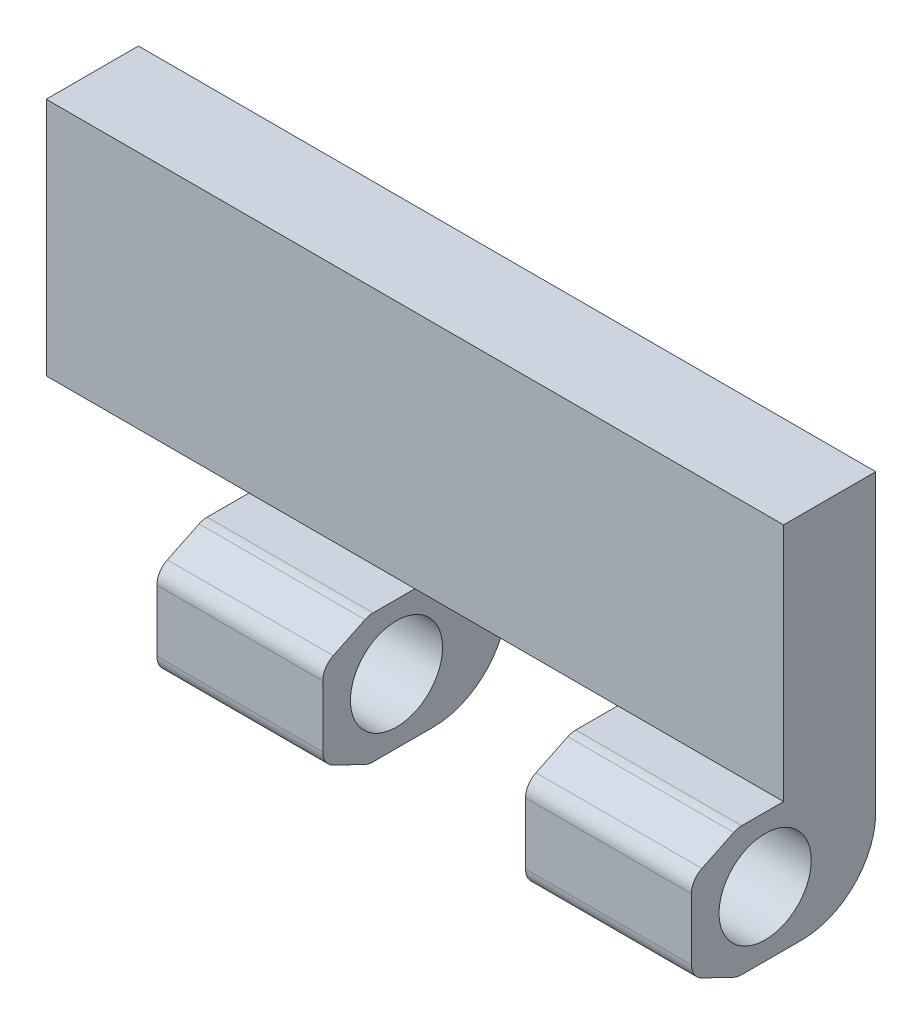
ISO-10303-21;
HEADER;
FILE_DESCRIPTION(('STEP AP214'),'2;1');
FILE_NAME('part.step','',(''),(''),'','','');
FILE_SCHEMA(('AUTOMOTIVE_DESIGN { 1 0 10303 214 1 1 1 1 }'));
ENDSEC;
DATA;
#1=APPLICATION_CONTEXT('core data for automotive mechanical design processes');
#2=APPLICATION_PROTOCOL_DEFINITION('international standard','automotive_design',2000,#1);
#3=PRODUCT_CONTEXT('',#1,'mechanical');
#4=PRODUCT('Part','Part','',(#3));
#5=PRODUCT_RELATED_PRODUCT_CATEGORY('part','',(#4));
#6=PRODUCT_DEFINITION_FORMATION('','',#4);
#7=PRODUCT_DEFINITION_CONTEXT('part definition',#1,'design');
#8=PRODUCT_DEFINITION('design','',#6,#7);
#9=PRODUCT_DEFINITION_SHAPE('','',#8);
#10=(LENGTH_UNIT() NAMED_UNIT(*) SI_UNIT(.MILLI.,.METRE.));
#11=(NAMED_UNIT(*) PLANE_ANGLE_UNIT() SI_UNIT($,.RADIAN.));
#12=(NAMED_UNIT(*) SI_UNIT($,.STERADIAN.) SOLID_ANGLE_UNIT());
#13=UNCERTAINTY_MEASURE_WITH_UNIT(LENGTH_MEASURE(1.E-05),#10,'distance_accuracy_value','');
#14=(GEOMETRIC_REPRESENTATION_CONTEXT(3) GLOBAL_UNCERTAINTY_ASSIGNED_CONTEXT((#13)) GLOBAL_UNIT_ASSIGNED_CONTEXT((#10,
#11,#12)) REPRESENTATION_CONTEXT('',''));
#15=CARTESIAN_POINT('',(0.,0.,0.));
#16=DIRECTION('',(0.,0.,1.));
#17=DIRECTION('',(1.,0.,0.));
#18=AXIS2_PLACEMENT_3D('',#15,#16,#17);
#19=CARTESIAN_POINT('',(11.,-6.5,0.));
#20=DIRECTION('',(0.,0.,-1.));
#21=DIRECTION('',(0.,1.,0.));
#22=AXIS2_PLACEMENT_3D('',#19,#20,#21);
#23=PLANE('',#22);
#24=DIRECTION('',(0.,1.,0.));
#25=VECTOR('',#24,1.);
#26=CARTESIAN_POINT('',(20.,-6.5,0.));
#27=LINE('',#26,#25);
#28=CARTESIAN_POINT('',(20.,-9.5,0.));
#29=VERTEX_POINT('',#28);
#30=CARTESIAN_POINT('',(20.,6.5,0.));
#31=VERTEX_POINT('',#30);
#32=EDGE_CURVE('E187',#29,#31,#27,.T.);
#33=ORIENTED_EDGE('',*,*,#32,.F.);
#34=DIRECTION('',(1.,0.,0.));
#35=VECTOR('',#34,1.);
#36=CARTESIAN_POINT('',(11.,-9.5,0.));
#37=LINE('',#36,#35);
#38=CARTESIAN_POINT('',(11.,-9.5,0.));
#39=VERTEX_POINT('',#38);
#40=EDGE_CURVE('E11',#39,#29,#37,.T.);
#41=ORIENTED_EDGE('',*,*,#40,.F.);
#42=DIRECTION('',(0.,1.,0.));
#43=VECTOR('',#42,1.);
#44=CARTESIAN_POINT('',(11.,-6.5,0.));
#45=LINE('',#44,#43);
#46=CARTESIAN_POINT('',(11.,-6.5,0.));
#47=VERTEX_POINT('',#46);
#48=EDGE_CURVE('E149',#39,#47,#45,.T.);
#49=ORIENTED_EDGE('',*,*,#48,.T.);
#50=DIRECTION('',(1.,0.,0.));
#51=VECTOR('',#50,1.);
#52=CARTESIAN_POINT('',(20.,-6.5,0.));
#53=LINE('',#52,#51);
#54=CARTESIAN_POINT('',(0.,-6.5,0.));
#55=VERTEX_POINT('',#54);
#56=EDGE_CURVE('E240',#55,#47,#53,.T.);
#57=ORIENTED_EDGE('',*,*,#56,.F.);
#58=DIRECTION('',(0.,1.,0.));
#59=VECTOR('',#58,1.);
#60=CARTESIAN_POINT('',(0.,-6.5,0.));
#61=LINE('',#60,#59);
#62=CARTESIAN_POINT('',(0.,-9.5,0.));
#63=VERTEX_POINT('',#62);
#64=EDGE_CURVE('E317',#63,#55,#61,.T.);
#65=ORIENTED_EDGE('',*,*,#64,.F.);
#66=DIRECTION('',(1.,0.,0.));
#67=VECTOR('',#66,1.);
#68=CARTESIAN_POINT('',(-9.,-9.5,0.));
#69=LINE('',#68,#67);
#70=CARTESIAN_POINT('',(-9.,-9.5,0.));
#71=VERTEX_POINT('',#70);
#72=EDGE_CURVE('E325',#71,#63,#69,.T.);
#73=ORIENTED_EDGE('',*,*,#72,.F.);
#74=DIRECTION('',(0.,1.,0.));
#75=VECTOR('',#74,1.);
#76=CARTESIAN_POINT('',(-9.,-6.5,0.));
#77=LINE('',#76,#75);
#78=CARTESIAN_POINT('',(-9.,-6.5,0.));
#79=VERTEX_POINT('',#78);
#80=EDGE_CURVE('E283',#71,#79,#77,.T.);
#81=ORIENTED_EDGE('',*,*,#80,.T.);
#82=CARTESIAN_POINT('',(-20.,-6.5,0.));
#83=VERTEX_POINT('',#82);
#84=EDGE_CURVE('E236',#83,#79,#53,.T.);
#85=ORIENTED_EDGE('',*,*,#84,.F.);
#86=DIRECTION('',(0.,-1.,0.));
#87=VECTOR('',#86,1.);
#88=CARTESIAN_POINT('',(-20.,-6.5,0.));
#89=LINE('',#88,#87);
#90=CARTESIAN_POINT('',(-20.,6.5,0.));
#91=VERTEX_POINT('',#90);
#92=EDGE_CURVE('E233',#91,#83,#89,.T.);
#93=ORIENTED_EDGE('',*,*,#92,.F.);
#94=DIRECTION('',(-1.,0.,0.));
#95=VECTOR('',#94,1.);
#96=CARTESIAN_POINT('',(20.,6.5,0.));
#97=LINE('',#96,#95);
#98=EDGE_CURVE('E231',#31,#91,#97,.T.);
#99=ORIENTED_EDGE('',*,*,#98,.F.);
#100=EDGE_LOOP('',(#33,#41,#49,#57,#65,#73,#81,#85,#93,#99));
#101=FACE_BOUND('',#100,.T.);
#102=ADVANCED_FACE('F41',(#101),#23,.T.);
#103=CARTESIAN_POINT('',(11.,-9.5,4.));
#104=DIRECTION('',(1.,0.,0.));
#105=DIRECTION('',(0.,0.,-1.));
#106=AXIS2_PLACEMENT_3D('',#103,#104,#105);
#107=CYLINDRICAL_SURFACE('',#106,4.);
#108=CARTESIAN_POINT('',(20.,-9.5,4.));
#109=DIRECTION('',(1.,0.,0.));
#110=DIRECTION('',(0.,0.,-1.));
#111=AXIS2_PLACEMENT_3D('',#108,#109,#110);
#112=CIRCLE('',#111,4.);
#113=CARTESIAN_POINT('',(20.,-13.5,4.));
#114=VERTEX_POINT('',#113);
#115=EDGE_CURVE('E140',#114,#29,#112,.T.);
#116=ORIENTED_EDGE('',*,*,#115,.F.);
#117=DIRECTION('',(1.,0.,0.));
#118=VECTOR('',#117,1.);
#119=CARTESIAN_POINT('',(11.,-13.5,4.));
#120=LINE('',#119,#118);
#121=CARTESIAN_POINT('',(11.,-13.5,4.));
#122=VERTEX_POINT('',#121);
#123=EDGE_CURVE('E49',#122,#114,#120,.T.);
#124=ORIENTED_EDGE('',*,*,#123,.F.);
#125=CARTESIAN_POINT('',(11.,-9.5,4.));
#126=DIRECTION('',(1.,0.,0.));
#127=DIRECTION('',(0.,0.,-1.));
#128=AXIS2_PLACEMENT_3D('',#125,#126,#127);
#129=CIRCLE('',#128,4.);
#130=EDGE_CURVE('E136',#122,#39,#129,.T.);
#131=ORIENTED_EDGE('',*,*,#130,.T.);
#132=ORIENTED_EDGE('',*,*,#40,.T.);
#133=EDGE_LOOP('',(#116,#124,#131,#132));
#134=FACE_BOUND('',#133,.T.);
#135=ADVANCED_FACE('F133',(#134),#107,.T.);
#136=CARTESIAN_POINT('',(11.,-13.5,4.));
#137=DIRECTION('',(0.,-1.,0.));
#138=DIRECTION('',(0.,0.,-1.));
#139=AXIS2_PLACEMENT_3D('',#136,#137,#138);
#140=PLANE('',#139);
#141=DIRECTION('',(0.,0.,-1.));
#142=VECTOR('',#141,1.);
#143=CARTESIAN_POINT('',(20.,-13.5,4.));
#144=LINE('',#143,#142);
#145=CARTESIAN_POINT('',(20.,-13.5,7.27242922935632));
#146=VERTEX_POINT('',#145);
#147=EDGE_CURVE('E181',#146,#114,#144,.T.);
#148=ORIENTED_EDGE('',*,*,#147,.F.);
#149=DIRECTION('',(1.,0.,0.));
#150=VECTOR('',#149,1.);
#151=CARTESIAN_POINT('',(11.,-13.5,7.27242922935632));
#152=LINE('',#151,#150);
#153=CARTESIAN_POINT('',(11.,-13.5,7.27242922935632));
#154=VERTEX_POINT('',#153);
#155=EDGE_CURVE('E142',#154,#146,#152,.T.);
#156=ORIENTED_EDGE('',*,*,#155,.F.);
#157=DIRECTION('',(0.,0.,-1.));
#158=VECTOR('',#157,1.);
#159=CARTESIAN_POINT('',(11.,-13.5,4.));
#160=LINE('',#159,#158);
#161=EDGE_CURVE('E150',#154,#122,#160,.T.);
#162=ORIENTED_EDGE('',*,*,#161,.T.);
#163=ORIENTED_EDGE('',*,*,#123,.T.);
#164=EDGE_LOOP('',(#148,#156,#162,#163));
#165=FACE_BOUND('',#164,.T.);
#166=ADVANCED_FACE('F151',(#165),#140,.T.);
#167=CARTESIAN_POINT('',(11.,-12.5,7.27242922935632));
#168=DIRECTION('',(1.,0.,0.));
#169=DIRECTION('',(0.,0.,-1.));
#170=AXIS2_PLACEMENT_3D('',#167,#168,#169);
#171=CYLINDRICAL_SURFACE('',#170,0.999999999999999);
#172=CARTESIAN_POINT('',(20.,-12.5,7.27242922935632));
#173=DIRECTION('',(1.,0.,0.));
#174=DIRECTION('',(0.,0.,-1.));
#175=AXIS2_PLACEMENT_3D('',#172,#173,#174);
#176=CIRCLE('',#175,0.999999999999999);
#177=CARTESIAN_POINT('',(20.,-13.4015230574683,7.7051602969411));
#178=VERTEX_POINT('',#177);
#179=EDGE_CURVE('E179',#178,#146,#176,.T.);
#180=ORIENTED_EDGE('',*,*,#179,.F.);
#181=DIRECTION('',(1.,0.,0.));
#182=VECTOR('',#181,1.);
#183=CARTESIAN_POINT('',(11.,-13.4015230574683,7.7051602969411));
#184=LINE('',#183,#182);
#185=CARTESIAN_POINT('',(11.,-13.4015230574683,7.7051602969411));
#186=VERTEX_POINT('',#185);
#187=EDGE_CURVE('E188',#186,#178,#184,.T.);
#188=ORIENTED_EDGE('',*,*,#187,.F.);
#189=CARTESIAN_POINT('',(11.,-12.5,7.27242922935632));
#190=DIRECTION('',(1.,0.,0.));
#191=DIRECTION('',(0.,0.,-1.));
#192=AXIS2_PLACEMENT_3D('',#189,#190,#191);
#193=CIRCLE('',#192,0.999999999999999);
#194=EDGE_CURVE('E155',#186,#154,#193,.T.);
#195=ORIENTED_EDGE('',*,*,#194,.T.);
#196=ORIENTED_EDGE('',*,*,#155,.T.);
#197=EDGE_LOOP('',(#180,#188,#195,#196));
#198=FACE_BOUND('',#197,.T.);
#199=ADVANCED_FACE('F488',(#198),#171,.T.);
#200=CARTESIAN_POINT('',(11.,-13.4015230574683,7.7051602969411));
#201=DIRECTION('',(0.,-0.901523057468274,0.43273106758477));
#202=DIRECTION('',(0.,-0.43273106758477,-0.901523057468274));
#203=AXIS2_PLACEMENT_3D('',#200,#201,#202);
#204=PLANE('',#203);
#205=DIRECTION('',(0.,-0.43273106758477,-0.901523057468274));
#206=VECTOR('',#205,1.);
#207=CARTESIAN_POINT('',(20.,-13.4015230574683,7.7051602969411));
#208=LINE('',#207,#206);
#209=CARTESIAN_POINT('',(20.,-12.5722890875593,9.43273106758476));
#210=VERTEX_POINT('',#209);
#211=EDGE_CURVE('E180',#210,#178,#208,.T.);
#212=ORIENTED_EDGE('',*,*,#211,.F.);
#213=DIRECTION('',(1.,0.,0.));
#214=VECTOR('',#213,1.);
#215=CARTESIAN_POINT('',(11.,-12.5722890875593,9.43273106758476));
#216=LINE('',#215,#214);
#217=CARTESIAN_POINT('',(11.,-12.5722890875593,9.43273106758476));
#218=VERTEX_POINT('',#217);
#219=EDGE_CURVE('E195',#218,#210,#216,.T.);
#220=ORIENTED_EDGE('',*,*,#219,.F.);
#221=DIRECTION('',(0.,-0.43273106758477,-0.901523057468274));
#222=VECTOR('',#221,1.);
#223=CARTESIAN_POINT('',(11.,-13.4015230574683,7.7051602969411));
#224=LINE('',#223,#222);
#225=EDGE_CURVE('E152',#218,#186,#224,.T.);
#226=ORIENTED_EDGE('',*,*,#225,.T.);
#227=ORIENTED_EDGE('',*,*,#187,.T.);
#228=EDGE_LOOP('',(#212,#220,#226,#227));
#229=FACE_BOUND('',#228,.T.);
#230=ADVANCED_FACE('F372',(#229),#204,.T.);
#231=CARTESIAN_POINT('',(11.,-11.670766030091,9.));
#232=DIRECTION('',(1.,0.,0.));
#233=DIRECTION('',(0.,0.,-1.));
#234=AXIS2_PLACEMENT_3D('',#231,#232,#233);
#235=CYLINDRICAL_SURFACE('',#234,0.999999999999999);
#236=CARTESIAN_POINT('',(20.,-11.670766030091,9.));
#237=DIRECTION('',(1.,0.,0.));
#238=DIRECTION('',(0.,0.,1.));
#239=AXIS2_PLACEMENT_3D('',#236,#237,#238);
#240=CIRCLE('',#239,0.999999999999999);
#241=CARTESIAN_POINT('',(20.,-11.670766030091,10.));
#242=VERTEX_POINT('',#241);
#243=EDGE_CURVE('E171',#242,#210,#240,.T.);
#244=ORIENTED_EDGE('',*,*,#243,.F.);
#245=DIRECTION('',(1.,0.,0.));
#246=VECTOR('',#245,1.);
#247=CARTESIAN_POINT('',(11.,-11.670766030091,10.));
#248=LINE('',#247,#246);
#249=CARTESIAN_POINT('',(11.,-11.670766030091,10.));
#250=VERTEX_POINT('',#249);
#251=EDGE_CURVE('E193',#250,#242,#248,.T.);
#252=ORIENTED_EDGE('',*,*,#251,.F.);
#253=CARTESIAN_POINT('',(11.,-11.670766030091,9.));
#254=DIRECTION('',(1.,0.,0.));
#255=DIRECTION('',(0.,0.,1.));
#256=AXIS2_PLACEMENT_3D('',#253,#254,#255);
#257=CIRCLE('',#256,0.999999999999999);
#258=EDGE_CURVE('E366',#250,#218,#257,.T.);
#259=ORIENTED_EDGE('',*,*,#258,.T.);
#260=ORIENTED_EDGE('',*,*,#219,.T.);
#261=EDGE_LOOP('',(#244,#252,#259,#260));
#262=FACE_BOUND('',#261,.T.);
#263=ADVANCED_FACE('F379',(#262),#235,.T.);
#264=CARTESIAN_POINT('',(11.,-11.670766030091,10.));
#265=DIRECTION('',(0.,0.,1.));
#266=DIRECTION('',(1.,0.,0.));
#267=AXIS2_PLACEMENT_3D('',#264,#265,#266);
#268=PLANE('',#267);
#269=DIRECTION('',(0.,-1.,0.));
#270=VECTOR('',#269,1.);
#271=CARTESIAN_POINT('',(20.,-11.670766030091,10.));
#272=LINE('',#271,#270);
#273=CARTESIAN_POINT('',(20.,-8.32923396990897,10.));
#274=VERTEX_POINT('',#273);
#275=EDGE_CURVE('E172',#274,#242,#272,.T.);
#276=ORIENTED_EDGE('',*,*,#275,.F.);
#277=DIRECTION('',(1.,0.,0.));
#278=VECTOR('',#277,1.);
#279=CARTESIAN_POINT('',(11.,-8.32923396990897,10.));
#280=LINE('',#279,#278);
#281=CARTESIAN_POINT('',(11.,-8.32923396990897,10.));
#282=VERTEX_POINT('',#281);
#283=EDGE_CURVE('E198',#282,#274,#280,.T.);
#284=ORIENTED_EDGE('',*,*,#283,.F.);
#285=DIRECTION('',(0.,-1.,0.));
#286=VECTOR('',#285,1.);
#287=CARTESIAN_POINT('',(11.,-11.670766030091,10.));
#288=LINE('',#287,#286);
#289=EDGE_CURVE('E364',#282,#250,#288,.T.);
#290=ORIENTED_EDGE('',*,*,#289,.T.);
#291=ORIENTED_EDGE('',*,*,#251,.T.);
#292=EDGE_LOOP('',(#276,#284,#290,#291));
#293=FACE_BOUND('',#292,.T.);
#294=ADVANCED_FACE('F382',(#293),#268,.T.);
#295=CARTESIAN_POINT('',(11.,-8.32923396990896,9.));
#296=DIRECTION('',(1.,0.,0.));
#297=DIRECTION('',(0.,0.,-1.));
#298=AXIS2_PLACEMENT_3D('',#295,#296,#297);
#299=CYLINDRICAL_SURFACE('',#298,1.);
#300=CARTESIAN_POINT('',(20.,-8.32923396990896,9.));
#301=DIRECTION('',(1.,0.,0.));
#302=DIRECTION('',(0.,0.,-1.));
#303=AXIS2_PLACEMENT_3D('',#300,#301,#302);
#304=CIRCLE('',#303,1.);
#305=CARTESIAN_POINT('',(20.,-7.42771091244068,9.43273106758476));
#306=VERTEX_POINT('',#305);
#307=EDGE_CURVE('E169',#306,#274,#304,.T.);
#308=ORIENTED_EDGE('',*,*,#307,.F.);
#309=DIRECTION('',(1.,0.,0.));
#310=VECTOR('',#309,1.);
#311=CARTESIAN_POINT('',(11.,-7.42771091244068,9.43273106758476));
#312=LINE('',#311,#310);
#313=CARTESIAN_POINT('',(11.,-7.42771091244068,9.43273106758476));
#314=VERTEX_POINT('',#313);
#315=EDGE_CURVE('E196',#314,#306,#312,.T.);
#316=ORIENTED_EDGE('',*,*,#315,.F.);
#317=CARTESIAN_POINT('',(11.,-8.32923396990896,9.));
#318=DIRECTION('',(1.,0.,0.));
#319=DIRECTION('',(0.,0.,-1.));
#320=AXIS2_PLACEMENT_3D('',#317,#318,#319);
#321=CIRCLE('',#320,1.);
#322=EDGE_CURVE('E362',#314,#282,#321,.T.);
#323=ORIENTED_EDGE('',*,*,#322,.T.);
#324=ORIENTED_EDGE('',*,*,#283,.T.);
#325=EDGE_LOOP('',(#308,#316,#323,#324));
#326=FACE_BOUND('',#325,.T.);
#327=ADVANCED_FACE('F389',(#326),#299,.T.);
#328=CARTESIAN_POINT('',(11.,-6.59847694253173,7.7051602969411));
#329=DIRECTION('',(0.,0.901523057468274,0.432731067584771));
#330=DIRECTION('',(0.,-0.432731067584771,0.901523057468274));
#331=AXIS2_PLACEMENT_3D('',#328,#329,#330);
#332=PLANE('',#331);
#333=DIRECTION('',(0.,-0.432731067584771,0.901523057468274));
#334=VECTOR('',#333,1.);
#335=CARTESIAN_POINT('',(20.,-6.59847694253173,7.7051602969411));
#336=LINE('',#335,#334);
#337=CARTESIAN_POINT('',(20.,-6.59847694253173,7.7051602969411));
#338=VERTEX_POINT('',#337);
#339=EDGE_CURVE('E164',#338,#306,#336,.T.);
#340=ORIENTED_EDGE('',*,*,#339,.F.);
#341=DIRECTION('',(1.,0.,0.));
#342=VECTOR('',#341,1.);
#343=CARTESIAN_POINT('',(11.,-6.59847694253173,7.7051602969411));
#344=LINE('',#343,#342);
#345=CARTESIAN_POINT('',(11.,-6.59847694253173,7.7051602969411));
#346=VERTEX_POINT('',#345);
#347=EDGE_CURVE('E200',#346,#338,#344,.T.);
#348=ORIENTED_EDGE('',*,*,#347,.F.);
#349=DIRECTION('',(0.,-0.432731067584771,0.901523057468274));
#350=VECTOR('',#349,1.);
#351=CARTESIAN_POINT('',(11.,-6.59847694253173,7.7051602969411));
#352=LINE('',#351,#350);
#353=EDGE_CURVE('E358',#346,#314,#352,.T.);
#354=ORIENTED_EDGE('',*,*,#353,.T.);
#355=ORIENTED_EDGE('',*,*,#315,.T.);
#356=EDGE_LOOP('',(#340,#348,#354,#355));
#357=FACE_BOUND('',#356,.T.);
#358=ADVANCED_FACE('F388',(#357),#332,.T.);
#359=CARTESIAN_POINT('',(11.,-7.5,7.27242922935632));
#360=DIRECTION('',(1.,0.,0.));
#361=DIRECTION('',(0.,0.,-1.));
#362=AXIS2_PLACEMENT_3D('',#359,#360,#361);
#363=CYLINDRICAL_SURFACE('',#362,1.);
#364=CARTESIAN_POINT('',(20.,-7.5,7.27242922935632));
#365=DIRECTION('',(1.,0.,0.));
#366=DIRECTION('',(0.,0.,1.));
#367=AXIS2_PLACEMENT_3D('',#364,#365,#366);
#368=CIRCLE('',#367,1.);
#369=CARTESIAN_POINT('',(20.,-6.5,7.27242922935632));
#370=VERTEX_POINT('',#369);
#371=EDGE_CURVE('E161',#370,#338,#368,.T.);
#372=ORIENTED_EDGE('',*,*,#371,.F.);
#373=DIRECTION('',(1.,0.,0.));
#374=VECTOR('',#373,1.);
#375=CARTESIAN_POINT('',(11.,-6.5,7.27242922935632));
#376=LINE('',#375,#374);
#377=CARTESIAN_POINT('',(11.,-6.5,7.27242922935632));
#378=VERTEX_POINT('',#377);
#379=EDGE_CURVE('E44',#378,#370,#376,.T.);
#380=ORIENTED_EDGE('',*,*,#379,.F.);
#381=CARTESIAN_POINT('',(11.,-7.5,7.27242922935632));
#382=DIRECTION('',(1.,0.,0.));
#383=DIRECTION('',(0.,0.,1.));
#384=AXIS2_PLACEMENT_3D('',#381,#382,#383);
#385=CIRCLE('',#384,1.);
#386=EDGE_CURVE('E360',#378,#346,#385,.T.);
#387=ORIENTED_EDGE('',*,*,#386,.T.);
#388=ORIENTED_EDGE('',*,*,#347,.T.);
#389=EDGE_LOOP('',(#372,#380,#387,#388));
#390=FACE_BOUND('',#389,.T.);
#391=ADVANCED_FACE('F206',(#390),#363,.T.);
#392=CARTESIAN_POINT('',(11.,-6.5,7.27242922935632));
#393=DIRECTION('',(0.,1.,0.));
#394=DIRECTION('',(0.,0.,1.));
#395=AXIS2_PLACEMENT_3D('',#392,#393,#394);
#396=PLANE('',#395);
#397=DIRECTION('',(1.,0.,0.));
#398=VECTOR('',#397,1.);
#399=CARTESIAN_POINT('',(20.,-6.5,5.));
#400=LINE('',#399,#398);
#401=CARTESIAN_POINT('',(11.,-6.5,5.));
#402=VERTEX_POINT('',#401);
#403=CARTESIAN_POINT('',(20.,-6.5,5.));
#404=VERTEX_POINT('',#403);
#405=EDGE_CURVE('E59',#402,#404,#400,.T.);
#406=ORIENTED_EDGE('',*,*,#405,.F.);
#407=DIRECTION('',(0.,0.,1.));
#408=VECTOR('',#407,1.);
#409=CARTESIAN_POINT('',(11.,-6.5,5.));
#410=LINE('',#409,#408);
#411=EDGE_CURVE('E108',#402,#378,#410,.T.);
#412=ORIENTED_EDGE('',*,*,#411,.T.);
#413=ORIENTED_EDGE('',*,*,#379,.T.);
#414=DIRECTION('',(0.,0.,1.));
#415=VECTOR('',#414,1.);
#416=CARTESIAN_POINT('',(20.,-6.5,7.27242922935632));
#417=LINE('',#416,#415);
#418=EDGE_CURVE('E157',#404,#370,#417,.T.);
#419=ORIENTED_EDGE('',*,*,#418,.F.);
#420=EDGE_LOOP('',(#406,#412,#413,#419));
#421=FACE_BOUND('',#420,.T.);
#422=ADVANCED_FACE('F43',(#421),#396,.T.);
#423=CARTESIAN_POINT('',(11.,-9.5,4.));
#424=DIRECTION('',(1.,0.,0.));
#425=DIRECTION('',(0.,0.,-1.));
#426=AXIS2_PLACEMENT_3D('',#423,#424,#425);
#427=PLANE('',#426);
#428=CARTESIAN_POINT('',(11.,-10.,6.));
#429=DIRECTION('',(1.,0.,0.));
#430=DIRECTION('',(0.,0.,-1.));
#431=AXIS2_PLACEMENT_3D('',#428,#429,#430);
#432=CIRCLE('',#431,2.5);
#433=CARTESIAN_POINT('',(11.,-10.,3.5));
#434=VERTEX_POINT('',#433);
#435=EDGE_CURVE('E165',#434,#434,#432,.T.);
#436=ORIENTED_EDGE('',*,*,#435,.T.);
#437=EDGE_LOOP('',(#436));
#438=FACE_BOUND('',#437,.T.);
#439=EDGE_CURVE('E66',#47,#402,#410,.T.);
#440=ORIENTED_EDGE('',*,*,#439,.F.);
#441=ORIENTED_EDGE('',*,*,#48,.F.);
#442=ORIENTED_EDGE('',*,*,#130,.F.);
#443=ORIENTED_EDGE('',*,*,#161,.F.);
#444=ORIENTED_EDGE('',*,*,#194,.F.);
#445=ORIENTED_EDGE('',*,*,#225,.F.);
#446=ORIENTED_EDGE('',*,*,#258,.F.);
#447=ORIENTED_EDGE('',*,*,#289,.F.);
#448=ORIENTED_EDGE('',*,*,#322,.F.);
#449=ORIENTED_EDGE('',*,*,#353,.F.);
#450=ORIENTED_EDGE('',*,*,#386,.F.);
#451=ORIENTED_EDGE('',*,*,#411,.F.);
#452=EDGE_LOOP('',(#440,#441,#442,#443,#444,#445,#446,#447,#448,#449,#450,#451));
#453=FACE_BOUND('',#452,.T.);
#454=ADVANCED_FACE('F144',(#438,#453),#427,.F.);
#455=CARTESIAN_POINT('',(20.,-9.5,4.));
#456=DIRECTION('',(1.,0.,0.));
#457=DIRECTION('',(0.,0.,-1.));
#458=AXIS2_PLACEMENT_3D('',#455,#456,#457);
#459=PLANE('',#458);
#460=CARTESIAN_POINT('',(20.,-10.,6.));
#461=DIRECTION('',(1.,0.,0.));
#462=DIRECTION('',(0.,0.,-1.));
#463=AXIS2_PLACEMENT_3D('',#460,#461,#462);
#464=CIRCLE('',#463,2.5);
#465=CARTESIAN_POINT('',(20.,-10.,3.5));
#466=VERTEX_POINT('',#465);
#467=EDGE_CURVE('E354',#466,#466,#464,.T.);
#468=ORIENTED_EDGE('',*,*,#467,.F.);
#469=EDGE_LOOP('',(#468));
#470=FACE_BOUND('',#469,.T.);
#471=ORIENTED_EDGE('',*,*,#32,.T.);
#472=DIRECTION('',(0.,0.,-1.));
#473=VECTOR('',#472,1.);
#474=CARTESIAN_POINT('',(20.,6.5,5.));
#475=LINE('',#474,#473);
#476=CARTESIAN_POINT('',(20.,6.5,5.));
#477=VERTEX_POINT('',#476);
#478=EDGE_CURVE('E214',#477,#31,#475,.T.);
#479=ORIENTED_EDGE('',*,*,#478,.F.);
#480=DIRECTION('',(0.,1.,0.));
#481=VECTOR('',#480,1.);
#482=CARTESIAN_POINT('',(20.,-6.5,5.));
#483=LINE('',#482,#481);
#484=EDGE_CURVE('E215',#404,#477,#483,.T.);
#485=ORIENTED_EDGE('',*,*,#484,.F.);
#486=ORIENTED_EDGE('',*,*,#418,.T.);
#487=ORIENTED_EDGE('',*,*,#371,.T.);
#488=ORIENTED_EDGE('',*,*,#339,.T.);
#489=ORIENTED_EDGE('',*,*,#307,.T.);
#490=ORIENTED_EDGE('',*,*,#275,.T.);
#491=ORIENTED_EDGE('',*,*,#243,.T.);
#492=ORIENTED_EDGE('',*,*,#211,.T.);
#493=ORIENTED_EDGE('',*,*,#179,.T.);
#494=ORIENTED_EDGE('',*,*,#147,.T.);
#495=ORIENTED_EDGE('',*,*,#115,.T.);
#496=EDGE_LOOP('',(#471,#479,#485,#486,#487,#488,#489,#490,#491,#492,#493,#494,#495));
#497=FACE_BOUND('',#496,.T.);
#498=ADVANCED_FACE('F208',(#470,#497),#459,.T.);
#499=CARTESIAN_POINT('',(11.,-10.,6.));
#500=DIRECTION('',(1.,0.,0.));
#501=DIRECTION('',(0.,0.,-1.));
#502=AXIS2_PLACEMENT_3D('',#499,#500,#501);
#503=CYLINDRICAL_SURFACE('',#502,2.5);
#504=ORIENTED_EDGE('',*,*,#435,.F.);
#505=EDGE_LOOP('',(#504));
#506=FACE_BOUND('',#505,.T.);
#507=ORIENTED_EDGE('',*,*,#467,.T.);
#508=EDGE_LOOP('',(#507));
#509=FACE_BOUND('',#508,.T.);
#510=ADVANCED_FACE('F506',(#506,#509),#503,.F.);
#511=CARTESIAN_POINT('',(20.,-6.5,5.));
#512=DIRECTION('',(0.,1.,0.));
#513=DIRECTION('',(0.,0.,1.));
#514=AXIS2_PLACEMENT_3D('',#511,#512,#513);
#515=PLANE('',#514);
#516=ORIENTED_EDGE('',*,*,#56,.T.);
#517=ORIENTED_EDGE('',*,*,#439,.T.);
#518=CARTESIAN_POINT('',(0.,-6.5,5.));
#519=VERTEX_POINT('',#518);
#520=EDGE_CURVE('E227',#519,#402,#400,.T.);
#521=ORIENTED_EDGE('',*,*,#520,.F.);
#522=DIRECTION('',(0.,0.,1.));
#523=VECTOR('',#522,1.);
#524=CARTESIAN_POINT('',(0.,-6.5,7.27242922935632));
#525=LINE('',#524,#523);
#526=EDGE_CURVE('E288',#55,#519,#525,.T.);
#527=ORIENTED_EDGE('',*,*,#526,.F.);
#528=EDGE_LOOP('',(#516,#517,#521,#527));
#529=FACE_BOUND('',#528,.T.);
#530=ADVANCED_FACE('F393',(#529),#515,.F.);
#531=CARTESIAN_POINT('',(-9.,-9.5,4.));
#532=DIRECTION('',(1.,0.,0.));
#533=DIRECTION('',(0.,0.,-1.));
#534=AXIS2_PLACEMENT_3D('',#531,#532,#533);
#535=CYLINDRICAL_SURFACE('',#534,4.);
#536=CARTESIAN_POINT('',(0.,-9.5,4.));
#537=DIRECTION('',(1.,0.,0.));
#538=DIRECTION('',(0.,0.,-1.));
#539=AXIS2_PLACEMENT_3D('',#536,#537,#538);
#540=CIRCLE('',#539,4.);
#541=CARTESIAN_POINT('',(0.,-13.5,4.));
#542=VERTEX_POINT('',#541);
#543=EDGE_CURVE('E316',#542,#63,#540,.T.);
#544=ORIENTED_EDGE('',*,*,#543,.F.);
#545=DIRECTION('',(1.,0.,0.));
#546=VECTOR('',#545,1.);
#547=CARTESIAN_POINT('',(-9.,-13.5,4.));
#548=LINE('',#547,#546);
#549=CARTESIAN_POINT('',(-9.,-13.5,4.));
#550=VERTEX_POINT('',#549);
#551=EDGE_CURVE('E324',#550,#542,#548,.T.);
#552=ORIENTED_EDGE('',*,*,#551,.F.);
#553=CARTESIAN_POINT('',(-9.,-9.5,4.));
#554=DIRECTION('',(1.,0.,0.));
#555=DIRECTION('',(0.,0.,-1.));
#556=AXIS2_PLACEMENT_3D('',#553,#554,#555);
#557=CIRCLE('',#556,4.);
#558=EDGE_CURVE('E285',#550,#71,#557,.T.);
#559=ORIENTED_EDGE('',*,*,#558,.T.);
#560=ORIENTED_EDGE('',*,*,#72,.T.);
#561=EDGE_LOOP('',(#544,#552,#559,#560));
#562=FACE_BOUND('',#561,.T.);
#563=ADVANCED_FACE('F549',(#562),#535,.T.);
#564=CARTESIAN_POINT('',(-9.,-13.5,4.));
#565=DIRECTION('',(0.,-1.,0.));
#566=DIRECTION('',(0.,0.,-1.));
#567=AXIS2_PLACEMENT_3D('',#564,#565,#566);
#568=PLANE('',#567);
#569=DIRECTION('',(0.,0.,-1.));
#570=VECTOR('',#569,1.);
#571=CARTESIAN_POINT('',(0.,-13.5,4.));
#572=LINE('',#571,#570);
#573=CARTESIAN_POINT('',(0.,-13.5,7.27242922935632));
#574=VERTEX_POINT('',#573);
#575=EDGE_CURVE('E311',#574,#542,#572,.T.);
#576=ORIENTED_EDGE('',*,*,#575,.F.);
#577=DIRECTION('',(1.,0.,0.));
#578=VECTOR('',#577,1.);
#579=CARTESIAN_POINT('',(-9.,-13.5,7.27242922935632));
#580=LINE('',#579,#578);
#581=CARTESIAN_POINT('',(-9.,-13.5,7.27242922935632));
#582=VERTEX_POINT('',#581);
#583=EDGE_CURVE('E327',#582,#574,#580,.T.);
#584=ORIENTED_EDGE('',*,*,#583,.F.);
#585=DIRECTION('',(0.,0.,-1.));
#586=VECTOR('',#585,1.);
#587=CARTESIAN_POINT('',(-9.,-13.5,4.));
#588=LINE('',#587,#586);
#589=EDGE_CURVE('E276',#582,#550,#588,.T.);
#590=ORIENTED_EDGE('',*,*,#589,.T.);
#591=ORIENTED_EDGE('',*,*,#551,.T.);
#592=EDGE_LOOP('',(#576,#584,#590,#591));
#593=FACE_BOUND('',#592,.T.);
#594=ADVANCED_FACE('F546',(#593),#568,.T.);
#595=CARTESIAN_POINT('',(-9.,-12.5,7.27242922935632));
#596=DIRECTION('',(1.,0.,0.));
#597=DIRECTION('',(0.,0.,-1.));
#598=AXIS2_PLACEMENT_3D('',#595,#596,#597);
#599=CYLINDRICAL_SURFACE('',#598,0.999999999999999);
#600=CARTESIAN_POINT('',(0.,-12.5,7.27242922935632));
#601=DIRECTION('',(1.,0.,0.));
#602=DIRECTION('',(0.,0.,-1.));
#603=AXIS2_PLACEMENT_3D('',#600,#601,#602);
#604=CIRCLE('',#603,0.999999999999999);
#605=CARTESIAN_POINT('',(0.,-13.4015230574683,7.7051602969411));
#606=VERTEX_POINT('',#605);
#607=EDGE_CURVE('E309',#606,#574,#604,.T.);
#608=ORIENTED_EDGE('',*,*,#607,.F.);
#609=DIRECTION('',(1.,0.,0.));
#610=VECTOR('',#609,1.);
#611=CARTESIAN_POINT('',(-9.,-13.4015230574683,7.7051602969411));
#612=LINE('',#611,#610);
#613=CARTESIAN_POINT('',(-9.,-13.4015230574683,7.7051602969411));
#614=VERTEX_POINT('',#613);
#615=EDGE_CURVE('E332',#614,#606,#612,.T.);
#616=ORIENTED_EDGE('',*,*,#615,.F.);
#617=CARTESIAN_POINT('',(-9.,-12.5,7.27242922935632));
#618=DIRECTION('',(1.,0.,0.));
#619=DIRECTION('',(0.,0.,-1.));
#620=AXIS2_PLACEMENT_3D('',#617,#618,#619);
#621=CIRCLE('',#620,0.999999999999999);
#622=EDGE_CURVE('E277',#614,#582,#621,.T.);
#623=ORIENTED_EDGE('',*,*,#622,.T.);
#624=ORIENTED_EDGE('',*,*,#583,.T.);
#625=EDGE_LOOP('',(#608,#616,#623,#624));
#626=FACE_BOUND('',#625,.T.);
#627=ADVANCED_FACE('F545',(#626),#599,.T.);
#628=CARTESIAN_POINT('',(-9.,-13.4015230574683,7.7051602969411));
#629=DIRECTION('',(0.,-0.901523057468274,0.43273106758477));
#630=DIRECTION('',(0.,-0.43273106758477,-0.901523057468274));
#631=AXIS2_PLACEMENT_3D('',#628,#629,#630);
#632=PLANE('',#631);
#633=DIRECTION('',(0.,-0.43273106758477,-0.901523057468274));
#634=VECTOR('',#633,1.);
#635=CARTESIAN_POINT('',(0.,-13.4015230574683,7.7051602969411));
#636=LINE('',#635,#634);
#637=CARTESIAN_POINT('',(0.,-12.5722890875593,9.43273106758476));
#638=VERTEX_POINT('',#637);
#639=EDGE_CURVE('E307',#638,#606,#636,.T.);
#640=ORIENTED_EDGE('',*,*,#639,.F.);
#641=DIRECTION('',(1.,0.,0.));
#642=VECTOR('',#641,1.);
#643=CARTESIAN_POINT('',(-9.,-12.5722890875593,9.43273106758476));
#644=LINE('',#643,#642);
#645=CARTESIAN_POINT('',(-9.,-12.5722890875593,9.43273106758476));
#646=VERTEX_POINT('',#645);
#647=EDGE_CURVE('E331',#646,#638,#644,.T.);
#648=ORIENTED_EDGE('',*,*,#647,.F.);
#649=DIRECTION('',(0.,-0.43273106758477,-0.901523057468274));
#650=VECTOR('',#649,1.);
#651=CARTESIAN_POINT('',(-9.,-13.4015230574683,7.7051602969411));
#652=LINE('',#651,#650);
#653=EDGE_CURVE('E272',#646,#614,#652,.T.);
#654=ORIENTED_EDGE('',*,*,#653,.T.);
#655=ORIENTED_EDGE('',*,*,#615,.T.);
#656=EDGE_LOOP('',(#640,#648,#654,#655));
#657=FACE_BOUND('',#656,.T.);
#658=ADVANCED_FACE('F538',(#657),#632,.T.);
#659=CARTESIAN_POINT('',(-9.,-11.670766030091,9.));
#660=DIRECTION('',(1.,0.,0.));
#661=DIRECTION('',(0.,0.,-1.));
#662=AXIS2_PLACEMENT_3D('',#659,#660,#661);
#663=CYLINDRICAL_SURFACE('',#662,0.999999999999999);
#664=CARTESIAN_POINT('',(0.,-11.670766030091,9.));
#665=DIRECTION('',(1.,0.,0.));
#666=DIRECTION('',(0.,0.,1.));
#667=AXIS2_PLACEMENT_3D('',#664,#665,#666);
#668=CIRCLE('',#667,0.999999999999999);
#669=CARTESIAN_POINT('',(0.,-11.670766030091,10.));
#670=VERTEX_POINT('',#669);
#671=EDGE_CURVE('E303',#670,#638,#668,.T.);
#672=ORIENTED_EDGE('',*,*,#671,.F.);
#673=DIRECTION('',(1.,0.,0.));
#674=VECTOR('',#673,1.);
#675=CARTESIAN_POINT('',(-9.,-11.670766030091,10.));
#676=LINE('',#675,#674);
#677=CARTESIAN_POINT('',(-9.,-11.670766030091,10.));
#678=VERTEX_POINT('',#677);
#679=EDGE_CURVE('E340',#678,#670,#676,.T.);
#680=ORIENTED_EDGE('',*,*,#679,.F.);
#681=CARTESIAN_POINT('',(-9.,-11.670766030091,9.));
#682=DIRECTION('',(1.,0.,0.));
#683=DIRECTION('',(0.,0.,1.));
#684=AXIS2_PLACEMENT_3D('',#681,#682,#683);
#685=CIRCLE('',#684,0.999999999999999);
#686=EDGE_CURVE('E269',#678,#646,#685,.T.);
#687=ORIENTED_EDGE('',*,*,#686,.T.);
#688=ORIENTED_EDGE('',*,*,#647,.T.);
#689=EDGE_LOOP('',(#672,#680,#687,#688));
#690=FACE_BOUND('',#689,.T.);
#691=ADVANCED_FACE('F534',(#690),#663,.T.);
#692=CARTESIAN_POINT('',(-9.,-11.670766030091,10.));
#693=DIRECTION('',(0.,0.,1.));
#694=DIRECTION('',(1.,0.,0.));
#695=AXIS2_PLACEMENT_3D('',#692,#693,#694);
#696=PLANE('',#695);
#697=DIRECTION('',(0.,-1.,0.));
#698=VECTOR('',#697,1.);
#699=CARTESIAN_POINT('',(0.,-11.670766030091,10.));
#700=LINE('',#699,#698);
#701=CARTESIAN_POINT('',(0.,-8.32923396990897,10.));
#702=VERTEX_POINT('',#701);
#703=EDGE_CURVE('E301',#702,#670,#700,.T.);
#704=ORIENTED_EDGE('',*,*,#703,.F.);
#705=DIRECTION('',(1.,0.,0.));
#706=VECTOR('',#705,1.);
#707=CARTESIAN_POINT('',(-9.,-8.32923396990897,10.));
#708=LINE('',#707,#706);
#709=CARTESIAN_POINT('',(-9.,-8.32923396990897,10.));
#710=VERTEX_POINT('',#709);
#711=EDGE_CURVE('E338',#710,#702,#708,.T.);
#712=ORIENTED_EDGE('',*,*,#711,.F.);
#713=DIRECTION('',(0.,-1.,0.));
#714=VECTOR('',#713,1.);
#715=CARTESIAN_POINT('',(-9.,-11.670766030091,10.));
#716=LINE('',#715,#714);
#717=EDGE_CURVE('E270',#710,#678,#716,.T.);
#718=ORIENTED_EDGE('',*,*,#717,.T.);
#719=ORIENTED_EDGE('',*,*,#679,.T.);
#720=EDGE_LOOP('',(#704,#712,#718,#719));
#721=FACE_BOUND('',#720,.T.);
#722=ADVANCED_FACE('F529',(#721),#696,.T.);
#723=CARTESIAN_POINT('',(-9.,-8.32923396990896,9.));
#724=DIRECTION('',(1.,0.,0.));
#725=DIRECTION('',(0.,0.,-1.));
#726=AXIS2_PLACEMENT_3D('',#723,#724,#725);
#727=CYLINDRICAL_SURFACE('',#726,1.);
#728=CARTESIAN_POINT('',(0.,-8.32923396990896,9.));
#729=DIRECTION('',(1.,0.,0.));
#730=DIRECTION('',(0.,0.,-1.));
#731=AXIS2_PLACEMENT_3D('',#728,#729,#730);
#732=CIRCLE('',#731,1.);
#733=CARTESIAN_POINT('',(0.,-7.42771091244068,9.43273106758476));
#734=VERTEX_POINT('',#733);
#735=EDGE_CURVE('E299',#734,#702,#732,.T.);
#736=ORIENTED_EDGE('',*,*,#735,.F.);
#737=DIRECTION('',(1.,0.,0.));
#738=VECTOR('',#737,1.);
#739=CARTESIAN_POINT('',(-9.,-7.42771091244068,9.43273106758476));
#740=LINE('',#739,#738);
#741=CARTESIAN_POINT('',(-9.,-7.42771091244068,9.43273106758476));
#742=VERTEX_POINT('',#741);
#743=EDGE_CURVE('E342',#742,#734,#740,.T.);
#744=ORIENTED_EDGE('',*,*,#743,.F.);
#745=CARTESIAN_POINT('',(-9.,-8.32923396990896,9.));
#746=DIRECTION('',(1.,0.,0.));
#747=DIRECTION('',(0.,0.,-1.));
#748=AXIS2_PLACEMENT_3D('',#745,#746,#747);
#749=CIRCLE('',#748,1.);
#750=EDGE_CURVE('E262',#742,#710,#749,.T.);
#751=ORIENTED_EDGE('',*,*,#750,.T.);
#752=ORIENTED_EDGE('',*,*,#711,.T.);
#753=EDGE_LOOP('',(#736,#744,#751,#752));
#754=FACE_BOUND('',#753,.T.);
#755=ADVANCED_FACE('F528',(#754),#727,.T.);
#756=CARTESIAN_POINT('',(-9.,-6.59847694253173,7.7051602969411));
#757=DIRECTION('',(0.,0.901523057468274,0.432731067584771));
#758=DIRECTION('',(0.,-0.432731067584771,0.901523057468274));
#759=AXIS2_PLACEMENT_3D('',#756,#757,#758);
#760=PLANE('',#759);
#761=DIRECTION('',(0.,-0.432731067584771,0.901523057468274));
#762=VECTOR('',#761,1.);
#763=CARTESIAN_POINT('',(0.,-6.59847694253173,7.7051602969411));
#764=LINE('',#763,#762);
#765=CARTESIAN_POINT('',(0.,-6.59847694253173,7.7051602969411));
#766=VERTEX_POINT('',#765);
#767=EDGE_CURVE('E293',#766,#734,#764,.T.);
#768=ORIENTED_EDGE('',*,*,#767,.F.);
#769=DIRECTION('',(1.,0.,0.));
#770=VECTOR('',#769,1.);
#771=CARTESIAN_POINT('',(-9.,-6.59847694253173,7.7051602969411));
#772=LINE('',#771,#770);
#773=CARTESIAN_POINT('',(-9.,-6.59847694253173,7.7051602969411));
#774=VERTEX_POINT('',#773);
#775=EDGE_CURVE('E347',#774,#766,#772,.T.);
#776=ORIENTED_EDGE('',*,*,#775,.F.);
#777=DIRECTION('',(0.,-0.432731067584771,0.901523057468274));
#778=VECTOR('',#777,1.);
#779=CARTESIAN_POINT('',(-9.,-6.59847694253173,7.7051602969411));
#780=LINE('',#779,#778);
#781=EDGE_CURVE('E261',#774,#742,#780,.T.);
#782=ORIENTED_EDGE('',*,*,#781,.T.);
#783=ORIENTED_EDGE('',*,*,#743,.T.);
#784=EDGE_LOOP('',(#768,#776,#782,#783));
#785=FACE_BOUND('',#784,.T.);
#786=ADVANCED_FACE('F525',(#785),#760,.T.);
#787=CARTESIAN_POINT('',(-9.,-7.5,7.27242922935632));
#788=DIRECTION('',(1.,0.,0.));
#789=DIRECTION('',(0.,0.,-1.));
#790=AXIS2_PLACEMENT_3D('',#787,#788,#789);
#791=CYLINDRICAL_SURFACE('',#790,1.);
#792=CARTESIAN_POINT('',(0.,-7.5,7.27242922935632));
#793=DIRECTION('',(1.,0.,0.));
#794=DIRECTION('',(0.,0.,1.));
#795=AXIS2_PLACEMENT_3D('',#792,#793,#794);
#796=CIRCLE('',#795,1.);
#797=CARTESIAN_POINT('',(0.,-6.5,7.27242922935632));
#798=VERTEX_POINT('',#797);
#799=EDGE_CURVE('E295',#798,#766,#796,.T.);
#800=ORIENTED_EDGE('',*,*,#799,.F.);
#801=DIRECTION('',(1.,0.,0.));
#802=VECTOR('',#801,1.);
#803=CARTESIAN_POINT('',(-9.,-6.5,7.27242922935632));
#804=LINE('',#803,#802);
#805=CARTESIAN_POINT('',(-9.,-6.5,7.27242922935632));
#806=VERTEX_POINT('',#805);
#807=EDGE_CURVE('E287',#806,#798,#804,.T.);
#808=ORIENTED_EDGE('',*,*,#807,.F.);
#809=CARTESIAN_POINT('',(-9.,-7.5,7.27242922935632));
#810=DIRECTION('',(1.,0.,0.));
#811=DIRECTION('',(0.,0.,1.));
#812=AXIS2_PLACEMENT_3D('',#809,#810,#811);
#813=CIRCLE('',#812,1.);
#814=EDGE_CURVE('E260',#806,#774,#813,.T.);
#815=ORIENTED_EDGE('',*,*,#814,.T.);
#816=ORIENTED_EDGE('',*,*,#775,.T.);
#817=EDGE_LOOP('',(#800,#808,#815,#816));
#818=FACE_BOUND('',#817,.T.);
#819=ADVANCED_FACE('F519',(#818),#791,.T.);
#820=CARTESIAN_POINT('',(-9.,-6.5,7.27242922935632));
#821=DIRECTION('',(0.,1.,0.));
#822=DIRECTION('',(0.,0.,1.));
#823=AXIS2_PLACEMENT_3D('',#820,#821,#822);
#824=PLANE('',#823);
#825=CARTESIAN_POINT('',(-9.,-6.5,5.));
#826=VERTEX_POINT('',#825);
#827=EDGE_CURVE('E229',#826,#519,#400,.T.);
#828=ORIENTED_EDGE('',*,*,#827,.F.);
#829=DIRECTION('',(0.,0.,1.));
#830=VECTOR('',#829,1.);
#831=CARTESIAN_POINT('',(-9.,-6.5,5.));
#832=LINE('',#831,#830);
#833=EDGE_CURVE('E256',#826,#806,#832,.T.);
#834=ORIENTED_EDGE('',*,*,#833,.T.);
#835=ORIENTED_EDGE('',*,*,#807,.T.);
#836=EDGE_CURVE('E253',#519,#798,#525,.T.);
#837=ORIENTED_EDGE('',*,*,#836,.F.);
#838=EDGE_LOOP('',(#828,#834,#835,#837));
#839=FACE_BOUND('',#838,.T.);
#840=ADVANCED_FACE('F514',(#839),#824,.T.);
#841=CARTESIAN_POINT('',(-9.,-9.5,4.));
#842=DIRECTION('',(1.,0.,0.));
#843=DIRECTION('',(0.,0.,-1.));
#844=AXIS2_PLACEMENT_3D('',#841,#842,#843);
#845=PLANE('',#844);
#846=CARTESIAN_POINT('',(-9.,-10.,6.));
#847=DIRECTION('',(1.,0.,0.));
#848=DIRECTION('',(0.,0.,-1.));
#849=AXIS2_PLACEMENT_3D('',#846,#847,#848);
#850=CIRCLE('',#849,2.5);
#851=CARTESIAN_POINT('',(-9.,-10.,3.5));
#852=VERTEX_POINT('',#851);
#853=EDGE_CURVE('E247',#852,#852,#850,.T.);
#854=ORIENTED_EDGE('',*,*,#853,.T.);
#855=EDGE_LOOP('',(#854));
#856=FACE_BOUND('',#855,.T.);
#857=EDGE_CURVE('E255',#79,#826,#832,.T.);
#858=ORIENTED_EDGE('',*,*,#857,.F.);
#859=ORIENTED_EDGE('',*,*,#80,.F.);
#860=ORIENTED_EDGE('',*,*,#558,.F.);
#861=ORIENTED_EDGE('',*,*,#589,.F.);
#862=ORIENTED_EDGE('',*,*,#622,.F.);
#863=ORIENTED_EDGE('',*,*,#653,.F.);
#864=ORIENTED_EDGE('',*,*,#686,.F.);
#865=ORIENTED_EDGE('',*,*,#717,.F.);
#866=ORIENTED_EDGE('',*,*,#750,.F.);
#867=ORIENTED_EDGE('',*,*,#781,.F.);
#868=ORIENTED_EDGE('',*,*,#814,.F.);
#869=ORIENTED_EDGE('',*,*,#833,.F.);
#870=EDGE_LOOP('',(#858,#859,#860,#861,#862,#863,#864,#865,#866,#867,#868,#869));
#871=FACE_BOUND('',#870,.T.);
#872=ADVANCED_FACE('F520',(#856,#871),#845,.F.);
#873=CARTESIAN_POINT('',(0.,-9.5,4.));
#874=DIRECTION('',(1.,0.,0.));
#875=DIRECTION('',(0.,0.,-1.));
#876=AXIS2_PLACEMENT_3D('',#873,#874,#875);
#877=PLANE('',#876);
#878=CARTESIAN_POINT('',(0.,-10.,6.));
#879=DIRECTION('',(1.,0.,0.));
#880=DIRECTION('',(0.,0.,-1.));
#881=AXIS2_PLACEMENT_3D('',#878,#879,#880);
#882=CIRCLE('',#881,2.5);
#883=CARTESIAN_POINT('',(0.,-10.,3.5));
#884=VERTEX_POINT('',#883);
#885=EDGE_CURVE('E250',#884,#884,#882,.T.);
#886=ORIENTED_EDGE('',*,*,#885,.F.);
#887=EDGE_LOOP('',(#886));
#888=FACE_BOUND('',#887,.T.);
#889=ORIENTED_EDGE('',*,*,#64,.T.);
#890=ORIENTED_EDGE('',*,*,#526,.T.);
#891=ORIENTED_EDGE('',*,*,#836,.T.);
#892=ORIENTED_EDGE('',*,*,#799,.T.);
#893=ORIENTED_EDGE('',*,*,#767,.T.);
#894=ORIENTED_EDGE('',*,*,#735,.T.);
#895=ORIENTED_EDGE('',*,*,#703,.T.);
#896=ORIENTED_EDGE('',*,*,#671,.T.);
#897=ORIENTED_EDGE('',*,*,#639,.T.);
#898=ORIENTED_EDGE('',*,*,#607,.T.);
#899=ORIENTED_EDGE('',*,*,#575,.T.);
#900=ORIENTED_EDGE('',*,*,#543,.T.);
#901=EDGE_LOOP('',(#889,#890,#891,#892,#893,#894,#895,#896,#897,#898,#899,#900));
#902=FACE_BOUND('',#901,.T.);
#903=ADVANCED_FACE('F483',(#888,#902),#877,.T.);
#904=CARTESIAN_POINT('',(-9.,-10.,6.));
#905=DIRECTION('',(1.,0.,0.));
#906=DIRECTION('',(0.,0.,-1.));
#907=AXIS2_PLACEMENT_3D('',#904,#905,#906);
#908=CYLINDRICAL_SURFACE('',#907,2.5);
#909=ORIENTED_EDGE('',*,*,#853,.F.);
#910=EDGE_LOOP('',(#909));
#911=FACE_BOUND('',#910,.T.);
#912=ORIENTED_EDGE('',*,*,#885,.T.);
#913=EDGE_LOOP('',(#912));
#914=FACE_BOUND('',#913,.T.);
#915=ADVANCED_FACE('F560',(#911,#914),#908,.F.);
#916=ORIENTED_EDGE('',*,*,#84,.T.);
#917=ORIENTED_EDGE('',*,*,#857,.T.);
#918=CARTESIAN_POINT('',(-20.,-6.5,5.));
#919=VERTEX_POINT('',#918);
#920=EDGE_CURVE('E222',#919,#826,#400,.T.);
#921=ORIENTED_EDGE('',*,*,#920,.F.);
#922=DIRECTION('',(0.,0.,-1.));
#923=VECTOR('',#922,1.);
#924=CARTESIAN_POINT('',(-20.,-6.5,5.));
#925=LINE('',#924,#923);
#926=EDGE_CURVE('E224',#919,#83,#925,.T.);
#927=ORIENTED_EDGE('',*,*,#926,.T.);
#928=EDGE_LOOP('',(#916,#917,#921,#927));
#929=FACE_BOUND('',#928,.T.);
#930=ADVANCED_FACE('F563',(#929),#515,.F.);
#931=CARTESIAN_POINT('',(20.,6.5,5.));
#932=DIRECTION('',(0.,-1.,0.));
#933=DIRECTION('',(0.,0.,-1.));
#934=AXIS2_PLACEMENT_3D('',#931,#932,#933);
#935=PLANE('',#934);
#936=ORIENTED_EDGE('',*,*,#98,.T.);
#937=DIRECTION('',(0.,0.,-1.));
#938=VECTOR('',#937,1.);
#939=CARTESIAN_POINT('',(-20.,6.5,5.));
#940=LINE('',#939,#938);
#941=CARTESIAN_POINT('',(-20.,6.5,5.));
#942=VERTEX_POINT('',#941);
#943=EDGE_CURVE('E241',#942,#91,#940,.T.);
#944=ORIENTED_EDGE('',*,*,#943,.F.);
#945=DIRECTION('',(-1.,0.,0.));
#946=VECTOR('',#945,1.);
#947=CARTESIAN_POINT('',(20.,6.5,5.));
#948=LINE('',#947,#946);
#949=EDGE_CURVE('E238',#477,#942,#948,.T.);
#950=ORIENTED_EDGE('',*,*,#949,.F.);
#951=ORIENTED_EDGE('',*,*,#478,.T.);
#952=EDGE_LOOP('',(#936,#944,#950,#951));
#953=FACE_BOUND('',#952,.T.);
#954=ADVANCED_FACE('F415',(#953),#935,.F.);
#955=CARTESIAN_POINT('',(-20.,-6.5,5.));
#956=DIRECTION('',(1.,0.,0.));
#957=DIRECTION('',(0.,0.,-1.));
#958=AXIS2_PLACEMENT_3D('',#955,#956,#957);
#959=PLANE('',#958);
#960=ORIENTED_EDGE('',*,*,#92,.T.);
#961=ORIENTED_EDGE('',*,*,#926,.F.);
#962=DIRECTION('',(0.,-1.,0.));
#963=VECTOR('',#962,1.);
#964=CARTESIAN_POINT('',(-20.,-6.5,5.));
#965=LINE('',#964,#963);
#966=EDGE_CURVE('E405',#942,#919,#965,.T.);
#967=ORIENTED_EDGE('',*,*,#966,.F.);
#968=ORIENTED_EDGE('',*,*,#943,.T.);
#969=EDGE_LOOP('',(#960,#961,#967,#968));
#970=FACE_BOUND('',#969,.T.);
#971=ADVANCED_FACE('F418',(#970),#959,.F.);
#972=CARTESIAN_POINT('',(0.,0.,5.));
#973=DIRECTION('',(0.,0.,-1.));
#974=DIRECTION('',(-1.,0.,0.));
#975=AXIS2_PLACEMENT_3D('',#972,#973,#974);
#976=PLANE('',#975);
#977=ORIENTED_EDGE('',*,*,#949,.T.);
#978=ORIENTED_EDGE('',*,*,#966,.T.);
#979=ORIENTED_EDGE('',*,*,#920,.T.);
#980=ORIENTED_EDGE('',*,*,#827,.T.);
#981=ORIENTED_EDGE('',*,*,#520,.T.);
#982=ORIENTED_EDGE('',*,*,#405,.T.);
#983=ORIENTED_EDGE('',*,*,#484,.T.);
#984=EDGE_LOOP('',(#977,#978,#979,#980,#981,#982,#983));
#985=FACE_BOUND('',#984,.T.);
#986=ADVANCED_FACE('F399',(#985),#976,.F.);
#987=CLOSED_SHELL('',(#102,#135,#166,#199,#230,#263,#294,#327,#358,#391,#422,#454,#498,#510,
#530,#563,#594,#627,#658,#691,#722,#755,#786,#819,#840,#872,#903,#915,#930,#954,#971,#986));
#988=MANIFOLD_SOLID_BREP('B2',#987);
#989=ADVANCED_BREP_SHAPE_REPRESENTATION('',(#18,#988),#14);
#990=SHAPE_DEFINITION_REPRESENTATION(#9,#989);
ENDSEC;
END-ISO-10303-21;
